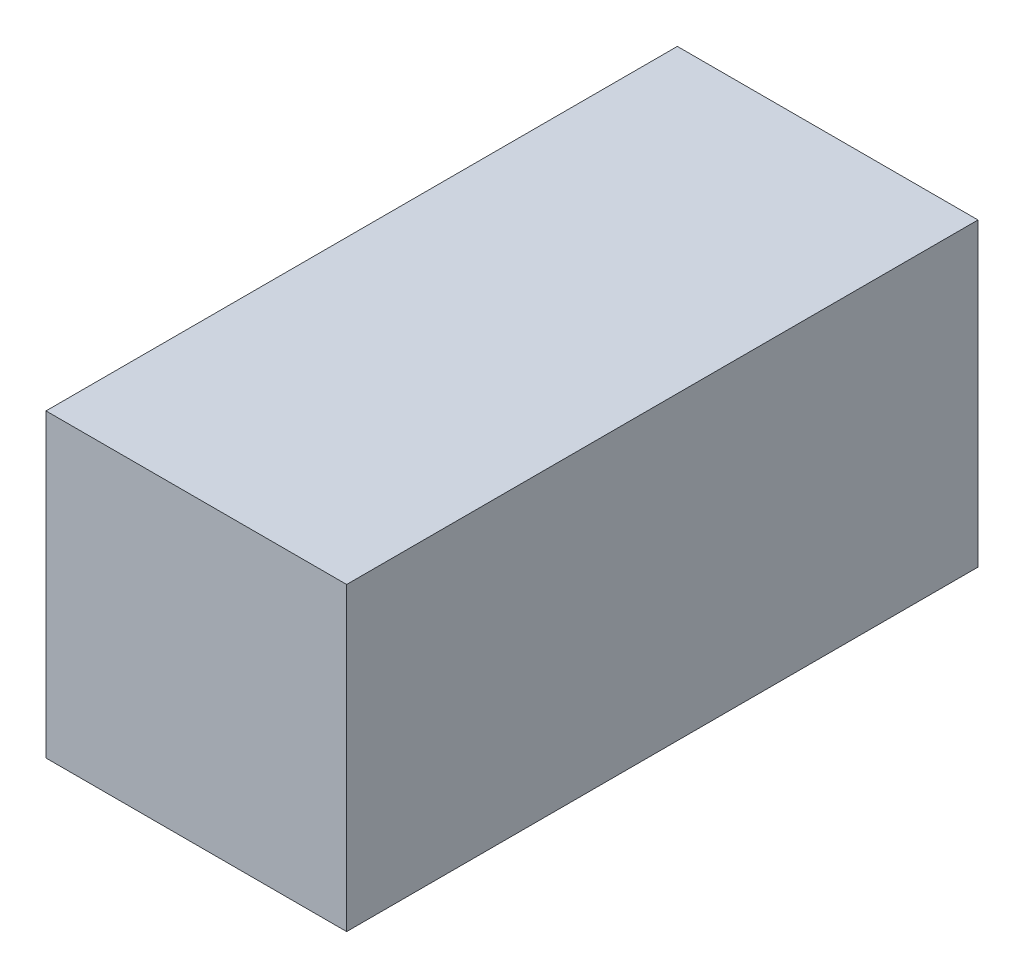
ISO-10303-21;
HEADER;
FILE_DESCRIPTION(('STEP AP214'),'2;1');
FILE_NAME('part.step','',(''),(''),'','','');
FILE_SCHEMA(('AUTOMOTIVE_DESIGN { 1 0 10303 214 1 1 1 1 }'));
ENDSEC;
DATA;
#1=APPLICATION_CONTEXT('core data for automotive mechanical design processes');
#2=APPLICATION_PROTOCOL_DEFINITION('international standard','automotive_design',2000,#1);
#3=PRODUCT_CONTEXT('',#1,'mechanical');
#4=PRODUCT('Part','Part','',(#3));
#5=PRODUCT_RELATED_PRODUCT_CATEGORY('part','',(#4));
#6=PRODUCT_DEFINITION_FORMATION('','',#4);
#7=PRODUCT_DEFINITION_CONTEXT('part definition',#1,'design');
#8=PRODUCT_DEFINITION('design','',#6,#7);
#9=PRODUCT_DEFINITION_SHAPE('','',#8);
#10=(LENGTH_UNIT() NAMED_UNIT(*) SI_UNIT(.MILLI.,.METRE.));
#11=(NAMED_UNIT(*) PLANE_ANGLE_UNIT() SI_UNIT($,.RADIAN.));
#12=(NAMED_UNIT(*) SI_UNIT($,.STERADIAN.) SOLID_ANGLE_UNIT());
#13=UNCERTAINTY_MEASURE_WITH_UNIT(LENGTH_MEASURE(1.E-05),#10,'distance_accuracy_value','');
#14=(GEOMETRIC_REPRESENTATION_CONTEXT(3) GLOBAL_UNCERTAINTY_ASSIGNED_CONTEXT((#13)) GLOBAL_UNIT_ASSIGNED_CONTEXT((#10,
#11,#12)) REPRESENTATION_CONTEXT('',''));
#15=CARTESIAN_POINT('',(0.,0.,0.));
#16=DIRECTION('',(0.,0.,1.));
#17=DIRECTION('',(1.,0.,0.));
#18=AXIS2_PLACEMENT_3D('',#15,#16,#17);
#19=CARTESIAN_POINT('',(50.,50.,-105.));
#20=DIRECTION('',(-1.,0.,0.));
#21=DIRECTION('',(0.,0.,1.));
#22=AXIS2_PLACEMENT_3D('',#19,#20,#21);
#23=PLANE('',#22);
#24=DIRECTION('',(0.,0.,-1.));
#25=VECTOR('',#24,1.);
#26=CARTESIAN_POINT('',(50.,-50.,-105.));
#27=LINE('',#26,#25);
#28=CARTESIAN_POINT('',(50.,-50.,105.));
#29=VERTEX_POINT('',#28);
#30=CARTESIAN_POINT('',(50.,-50.,-105.));
#31=VERTEX_POINT('',#30);
#32=EDGE_CURVE('E111',#29,#31,#27,.T.);
#33=ORIENTED_EDGE('',*,*,#32,.T.);
#34=DIRECTION('',(0.,-1.,0.));
#35=VECTOR('',#34,1.);
#36=CARTESIAN_POINT('',(50.,50.,-105.));
#37=LINE('',#36,#35);
#38=CARTESIAN_POINT('',(50.,50.,-105.));
#39=VERTEX_POINT('',#38);
#40=EDGE_CURVE('E11',#39,#31,#37,.T.);
#41=ORIENTED_EDGE('',*,*,#40,.F.);
#42=DIRECTION('',(0.,0.,-1.));
#43=VECTOR('',#42,1.);
#44=CARTESIAN_POINT('',(50.,50.,-105.));
#45=LINE('',#44,#43);
#46=CARTESIAN_POINT('',(50.,50.,105.));
#47=VERTEX_POINT('',#46);
#48=EDGE_CURVE('E95',#47,#39,#45,.T.);
#49=ORIENTED_EDGE('',*,*,#48,.F.);
#50=DIRECTION('',(0.,-1.,0.));
#51=VECTOR('',#50,1.);
#52=CARTESIAN_POINT('',(50.,50.,105.));
#53=LINE('',#52,#51);
#54=EDGE_CURVE('E107',#47,#29,#53,.T.);
#55=ORIENTED_EDGE('',*,*,#54,.T.);
#56=EDGE_LOOP('',(#33,#41,#49,#55));
#57=FACE_BOUND('',#56,.T.);
#58=ADVANCED_FACE('F43',(#57),#23,.F.);
#59=CARTESIAN_POINT('',(-50.,50.,-105.));
#60=DIRECTION('',(0.,0.,1.));
#61=DIRECTION('',(1.,0.,0.));
#62=AXIS2_PLACEMENT_3D('',#59,#60,#61);
#63=PLANE('',#62);
#64=DIRECTION('',(-1.,0.,0.));
#65=VECTOR('',#64,1.);
#66=CARTESIAN_POINT('',(-50.,-50.,-105.));
#67=LINE('',#66,#65);
#68=CARTESIAN_POINT('',(-50.,-50.,-105.));
#69=VERTEX_POINT('',#68);
#70=EDGE_CURVE('E100',#31,#69,#67,.T.);
#71=ORIENTED_EDGE('',*,*,#70,.T.);
#72=DIRECTION('',(0.,-1.,0.));
#73=VECTOR('',#72,1.);
#74=CARTESIAN_POINT('',(-50.,50.,-105.));
#75=LINE('',#74,#73);
#76=CARTESIAN_POINT('',(-50.,50.,-105.));
#77=VERTEX_POINT('',#76);
#78=EDGE_CURVE('E52',#77,#69,#75,.T.);
#79=ORIENTED_EDGE('',*,*,#78,.F.);
#80=DIRECTION('',(-1.,0.,0.));
#81=VECTOR('',#80,1.);
#82=CARTESIAN_POINT('',(-50.,50.,-105.));
#83=LINE('',#82,#81);
#84=EDGE_CURVE('E90',#39,#77,#83,.T.);
#85=ORIENTED_EDGE('',*,*,#84,.F.);
#86=ORIENTED_EDGE('',*,*,#40,.T.);
#87=EDGE_LOOP('',(#71,#79,#85,#86));
#88=FACE_BOUND('',#87,.T.);
#89=ADVANCED_FACE('F99',(#88),#63,.F.);
#90=CARTESIAN_POINT('',(-50.,50.,-105.));
#91=DIRECTION('',(1.,0.,0.));
#92=DIRECTION('',(0.,0.,-1.));
#93=AXIS2_PLACEMENT_3D('',#90,#91,#92);
#94=PLANE('',#93);
#95=DIRECTION('',(0.,0.,1.));
#96=VECTOR('',#95,1.);
#97=CARTESIAN_POINT('',(-50.,-50.,-105.));
#98=LINE('',#97,#96);
#99=CARTESIAN_POINT('',(-50.,-50.,105.));
#100=VERTEX_POINT('',#99);
#101=EDGE_CURVE('E77',#69,#100,#98,.T.);
#102=ORIENTED_EDGE('',*,*,#101,.T.);
#103=DIRECTION('',(0.,-1.,0.));
#104=VECTOR('',#103,1.);
#105=CARTESIAN_POINT('',(-50.,50.,105.));
#106=LINE('',#105,#104);
#107=CARTESIAN_POINT('',(-50.,50.,105.));
#108=VERTEX_POINT('',#107);
#109=EDGE_CURVE('E102',#108,#100,#106,.T.);
#110=ORIENTED_EDGE('',*,*,#109,.F.);
#111=DIRECTION('',(0.,0.,1.));
#112=VECTOR('',#111,1.);
#113=CARTESIAN_POINT('',(-50.,50.,-105.));
#114=LINE('',#113,#112);
#115=EDGE_CURVE('E93',#77,#108,#114,.T.);
#116=ORIENTED_EDGE('',*,*,#115,.F.);
#117=ORIENTED_EDGE('',*,*,#78,.T.);
#118=EDGE_LOOP('',(#102,#110,#116,#117));
#119=FACE_BOUND('',#118,.T.);
#120=ADVANCED_FACE('F103',(#119),#94,.F.);
#121=CARTESIAN_POINT('',(-50.,50.,105.));
#122=DIRECTION('',(0.,0.,-1.));
#123=DIRECTION('',(-1.,0.,0.));
#124=AXIS2_PLACEMENT_3D('',#121,#122,#123);
#125=PLANE('',#124);
#126=DIRECTION('',(1.,0.,0.));
#127=VECTOR('',#126,1.);
#128=CARTESIAN_POINT('',(-50.,-50.,105.));
#129=LINE('',#128,#127);
#130=EDGE_CURVE('E83',#100,#29,#129,.T.);
#131=ORIENTED_EDGE('',*,*,#130,.T.);
#132=ORIENTED_EDGE('',*,*,#54,.F.);
#133=DIRECTION('',(1.,0.,0.));
#134=VECTOR('',#133,1.);
#135=CARTESIAN_POINT('',(-50.,50.,105.));
#136=LINE('',#135,#134);
#137=EDGE_CURVE('E60',#108,#47,#136,.T.);
#138=ORIENTED_EDGE('',*,*,#137,.F.);
#139=ORIENTED_EDGE('',*,*,#109,.T.);
#140=EDGE_LOOP('',(#131,#132,#138,#139));
#141=FACE_BOUND('',#140,.T.);
#142=ADVANCED_FACE('F124',(#141),#125,.F.);
#143=CARTESIAN_POINT('',(0.,50.,0.));
#144=DIRECTION('',(0.,1.,0.));
#145=DIRECTION('',(0.,0.,1.));
#146=AXIS2_PLACEMENT_3D('',#143,#144,#145);
#147=PLANE('',#146);
#148=ORIENTED_EDGE('',*,*,#48,.T.);
#149=ORIENTED_EDGE('',*,*,#84,.T.);
#150=ORIENTED_EDGE('',*,*,#115,.T.);
#151=ORIENTED_EDGE('',*,*,#137,.T.);
#152=EDGE_LOOP('',(#148,#149,#150,#151));
#153=FACE_BOUND('',#152,.T.);
#154=ADVANCED_FACE('F91',(#153),#147,.T.);
#155=CARTESIAN_POINT('',(0.,-50.,0.));
#156=DIRECTION('',(0.,1.,0.));
#157=DIRECTION('',(0.,0.,1.));
#158=AXIS2_PLACEMENT_3D('',#155,#156,#157);
#159=PLANE('',#158);
#160=ORIENTED_EDGE('',*,*,#32,.F.);
#161=ORIENTED_EDGE('',*,*,#130,.F.);
#162=ORIENTED_EDGE('',*,*,#101,.F.);
#163=ORIENTED_EDGE('',*,*,#70,.F.);
#164=EDGE_LOOP('',(#160,#161,#162,#163));
#165=FACE_BOUND('',#164,.T.);
#166=ADVANCED_FACE('F127',(#165),#159,.F.);
#167=CLOSED_SHELL('',(#58,#89,#120,#142,#154,#166));
#168=MANIFOLD_SOLID_BREP('B2',#167);
#169=ADVANCED_BREP_SHAPE_REPRESENTATION('',(#18,#168),#14);
#170=SHAPE_DEFINITION_REPRESENTATION(#9,#169);
ENDSEC;
END-ISO-10303-21;
